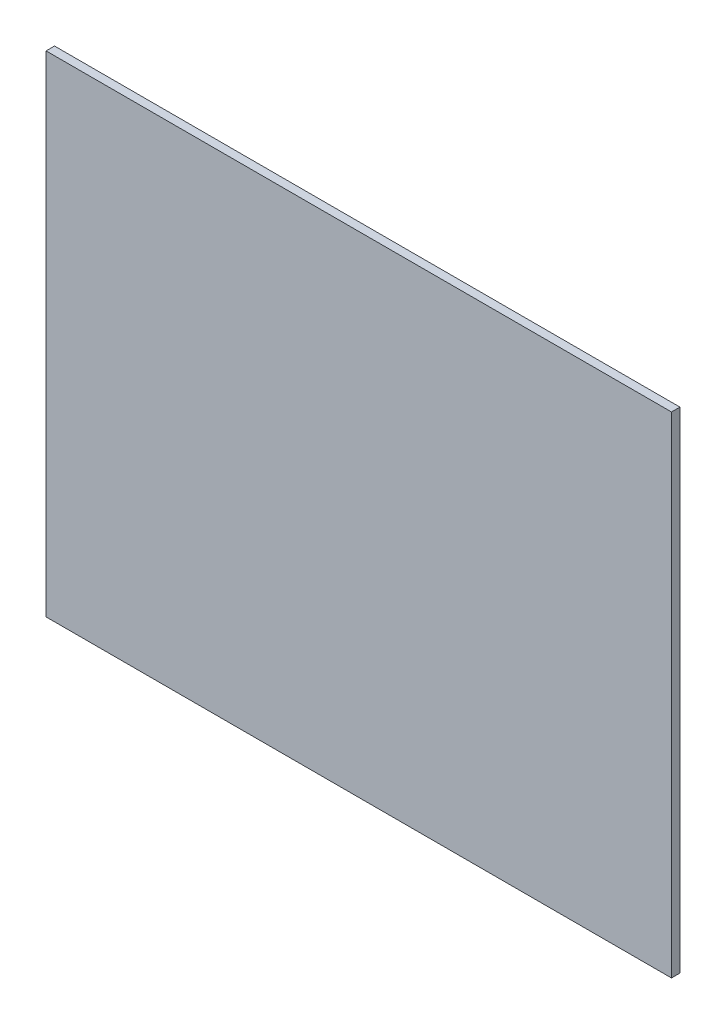
ISO-10303-21;
HEADER;
FILE_DESCRIPTION(('STEP AP214'),'2;1');
FILE_NAME('part.step','',(''),(''),'','','');
FILE_SCHEMA(('AUTOMOTIVE_DESIGN { 1 0 10303 214 1 1 1 1 }'));
ENDSEC;
DATA;
#1=APPLICATION_CONTEXT('core data for automotive mechanical design processes');
#2=APPLICATION_PROTOCOL_DEFINITION('international standard','automotive_design',2000,#1);
#3=PRODUCT_CONTEXT('',#1,'mechanical');
#4=PRODUCT('Part','Part','',(#3));
#5=PRODUCT_RELATED_PRODUCT_CATEGORY('part','',(#4));
#6=PRODUCT_DEFINITION_FORMATION('','',#4);
#7=PRODUCT_DEFINITION_CONTEXT('part definition',#1,'design');
#8=PRODUCT_DEFINITION('design','',#6,#7);
#9=PRODUCT_DEFINITION_SHAPE('','',#8);
#10=(LENGTH_UNIT() NAMED_UNIT(*) SI_UNIT(.MILLI.,.METRE.));
#11=(NAMED_UNIT(*) PLANE_ANGLE_UNIT() SI_UNIT($,.RADIAN.));
#12=(NAMED_UNIT(*) SI_UNIT($,.STERADIAN.) SOLID_ANGLE_UNIT());
#13=UNCERTAINTY_MEASURE_WITH_UNIT(LENGTH_MEASURE(1.E-05),#10,'distance_accuracy_value','');
#14=(GEOMETRIC_REPRESENTATION_CONTEXT(3) GLOBAL_UNCERTAINTY_ASSIGNED_CONTEXT((#13)) GLOBAL_UNIT_ASSIGNED_CONTEXT((#10,
#11,#12)) REPRESENTATION_CONTEXT('',''));
#15=CARTESIAN_POINT('',(0.,0.,0.));
#16=DIRECTION('',(0.,0.,1.));
#17=DIRECTION('',(1.,0.,0.));
#18=AXIS2_PLACEMENT_3D('',#15,#16,#17);
#19=CARTESIAN_POINT('',(0.5,0.87,-2.85063822565036));
#20=DIRECTION('',(0.,1.,0.));
#21=DIRECTION('',(0.,0.,1.));
#22=AXIS2_PLACEMENT_3D('',#19,#20,#21);
#23=PLANE('',#22);
#24=DIRECTION('',(1.,0.,0.));
#25=VECTOR('',#24,1.);
#26=CARTESIAN_POINT('',(0.5,0.87,-0.0300000000000001));
#27=LINE('',#26,#25);
#28=CARTESIAN_POINT('',(-1.72,0.87,-0.0300000000000001));
#29=VERTEX_POINT('',#28);
#30=CARTESIAN_POINT('',(0.5,0.87,-0.0300000000000001));
#31=VERTEX_POINT('',#30);
#32=EDGE_CURVE('E41',#29,#31,#27,.T.);
#33=ORIENTED_EDGE('',*,*,#32,.F.);
#34=DIRECTION('',(0.,0.,1.));
#35=VECTOR('',#34,1.);
#36=CARTESIAN_POINT('',(-1.72,0.87,-2.85063822565036));
#37=LINE('',#36,#35);
#38=CARTESIAN_POINT('',(-1.72,0.87,0.));
#39=VERTEX_POINT('',#38);
#40=EDGE_CURVE('E69',#29,#39,#37,.T.);
#41=ORIENTED_EDGE('',*,*,#40,.T.);
#42=DIRECTION('',(-1.,0.,0.));
#43=VECTOR('',#42,1.);
#44=CARTESIAN_POINT('',(0.5,0.87,0.));
#45=LINE('',#44,#43);
#46=CARTESIAN_POINT('',(0.5,0.87,0.));
#47=VERTEX_POINT('',#46);
#48=EDGE_CURVE('E73',#47,#39,#45,.T.);
#49=ORIENTED_EDGE('',*,*,#48,.F.);
#50=DIRECTION('',(0.,0.,1.));
#51=VECTOR('',#50,1.);
#52=CARTESIAN_POINT('',(0.5,0.87,-2.85063822565036));
#53=LINE('',#52,#51);
#54=EDGE_CURVE('E96',#31,#47,#53,.T.);
#55=ORIENTED_EDGE('',*,*,#54,.F.);
#56=EDGE_LOOP('',(#33,#41,#49,#55));
#57=FACE_BOUND('',#56,.T.);
#58=ADVANCED_FACE('F33',(#57),#23,.T.);
#59=CARTESIAN_POINT('',(0.5,-0.87,-2.85063822565036));
#60=DIRECTION('',(1.,0.,0.));
#61=DIRECTION('',(0.,0.,-1.));
#62=AXIS2_PLACEMENT_3D('',#59,#60,#61);
#63=PLANE('',#62);
#64=DIRECTION('',(0.,-1.,0.));
#65=VECTOR('',#64,1.);
#66=CARTESIAN_POINT('',(0.5,-0.87,-0.0300000000000001));
#67=LINE('',#66,#65);
#68=CARTESIAN_POINT('',(0.5,-0.87,-0.0300000000000001));
#69=VERTEX_POINT('',#68);
#70=EDGE_CURVE('E47',#31,#69,#67,.T.);
#71=ORIENTED_EDGE('',*,*,#70,.F.);
#72=ORIENTED_EDGE('',*,*,#54,.T.);
#73=DIRECTION('',(0.,1.,0.));
#74=VECTOR('',#73,1.);
#75=CARTESIAN_POINT('',(0.5,-0.87,0.));
#76=LINE('',#75,#74);
#77=CARTESIAN_POINT('',(0.5,-0.87,0.));
#78=VERTEX_POINT('',#77);
#79=EDGE_CURVE('E78',#78,#47,#76,.T.);
#80=ORIENTED_EDGE('',*,*,#79,.F.);
#81=DIRECTION('',(0.,0.,1.));
#82=VECTOR('',#81,1.);
#83=CARTESIAN_POINT('',(0.5,-0.87,-2.85063822565036));
#84=LINE('',#83,#82);
#85=EDGE_CURVE('E99',#69,#78,#84,.T.);
#86=ORIENTED_EDGE('',*,*,#85,.F.);
#87=EDGE_LOOP('',(#71,#72,#80,#86));
#88=FACE_BOUND('',#87,.T.);
#89=ADVANCED_FACE('F105',(#88),#63,.T.);
#90=CARTESIAN_POINT('',(-1.72,-0.87,-2.85063822565036));
#91=DIRECTION('',(0.,-1.,0.));
#92=DIRECTION('',(0.,0.,-1.));
#93=AXIS2_PLACEMENT_3D('',#90,#91,#92);
#94=PLANE('',#93);
#95=DIRECTION('',(-1.,0.,0.));
#96=VECTOR('',#95,1.);
#97=CARTESIAN_POINT('',(-1.72,-0.87,-0.0300000000000001));
#98=LINE('',#97,#96);
#99=CARTESIAN_POINT('',(-1.72,-0.87,-0.0300000000000001));
#100=VERTEX_POINT('',#99);
#101=EDGE_CURVE('E98',#69,#100,#98,.T.);
#102=ORIENTED_EDGE('',*,*,#101,.F.);
#103=ORIENTED_EDGE('',*,*,#85,.T.);
#104=DIRECTION('',(1.,0.,0.));
#105=VECTOR('',#104,1.);
#106=CARTESIAN_POINT('',(-1.72,-0.87,0.));
#107=LINE('',#106,#105);
#108=CARTESIAN_POINT('',(-1.72,-0.87,0.));
#109=VERTEX_POINT('',#108);
#110=EDGE_CURVE('E86',#109,#78,#107,.T.);
#111=ORIENTED_EDGE('',*,*,#110,.F.);
#112=DIRECTION('',(0.,0.,1.));
#113=VECTOR('',#112,1.);
#114=CARTESIAN_POINT('',(-1.72,-0.87,-2.85063822565036));
#115=LINE('',#114,#113);
#116=EDGE_CURVE('E77',#100,#109,#115,.T.);
#117=ORIENTED_EDGE('',*,*,#116,.F.);
#118=EDGE_LOOP('',(#102,#103,#111,#117));
#119=FACE_BOUND('',#118,.T.);
#120=ADVANCED_FACE('F103',(#119),#94,.T.);
#121=CARTESIAN_POINT('',(-1.72,0.87,-2.85063822565036));
#122=DIRECTION('',(-1.,0.,0.));
#123=DIRECTION('',(0.,0.,1.));
#124=AXIS2_PLACEMENT_3D('',#121,#122,#123);
#125=PLANE('',#124);
#126=DIRECTION('',(0.,1.,0.));
#127=VECTOR('',#126,1.);
#128=CARTESIAN_POINT('',(-1.72,0.87,-0.0300000000000001));
#129=LINE('',#128,#127);
#130=EDGE_CURVE('E11',#100,#29,#129,.T.);
#131=ORIENTED_EDGE('',*,*,#130,.F.);
#132=ORIENTED_EDGE('',*,*,#116,.T.);
#133=DIRECTION('',(0.,-1.,0.));
#134=VECTOR('',#133,1.);
#135=CARTESIAN_POINT('',(-1.72,0.87,0.));
#136=LINE('',#135,#134);
#137=EDGE_CURVE('E80',#39,#109,#136,.T.);
#138=ORIENTED_EDGE('',*,*,#137,.F.);
#139=ORIENTED_EDGE('',*,*,#40,.F.);
#140=EDGE_LOOP('',(#131,#132,#138,#139));
#141=FACE_BOUND('',#140,.T.);
#142=ADVANCED_FACE('F81',(#141),#125,.T.);
#143=CARTESIAN_POINT('',(0.,0.,0.));
#144=DIRECTION('',(0.,0.,1.));
#145=DIRECTION('',(1.,0.,0.));
#146=AXIS2_PLACEMENT_3D('',#143,#144,#145);
#147=PLANE('',#146);
#148=ORIENTED_EDGE('',*,*,#48,.T.);
#149=ORIENTED_EDGE('',*,*,#137,.T.);
#150=ORIENTED_EDGE('',*,*,#110,.T.);
#151=ORIENTED_EDGE('',*,*,#79,.T.);
#152=EDGE_LOOP('',(#148,#149,#150,#151));
#153=FACE_BOUND('',#152,.T.);
#154=ADVANCED_FACE('F88',(#153),#147,.T.);
#155=CARTESIAN_POINT('',(0.,0.,-0.03));
#156=DIRECTION('',(0.,0.,1.));
#157=DIRECTION('',(0.,1.,0.));
#158=AXIS2_PLACEMENT_3D('',#155,#156,#157);
#159=PLANE('',#158);
#160=ORIENTED_EDGE('',*,*,#32,.T.);
#161=ORIENTED_EDGE('',*,*,#70,.T.);
#162=ORIENTED_EDGE('',*,*,#101,.T.);
#163=ORIENTED_EDGE('',*,*,#130,.T.);
#164=EDGE_LOOP('',(#160,#161,#162,#163));
#165=FACE_BOUND('',#164,.T.);
#166=ADVANCED_FACE('F107',(#165),#159,.F.);
#167=CLOSED_SHELL('',(#58,#89,#120,#142,#154,#166));
#168=MANIFOLD_SOLID_BREP('B2',#167);
#169=ADVANCED_BREP_SHAPE_REPRESENTATION('',(#18,#168),#14);
#170=SHAPE_DEFINITION_REPRESENTATION(#9,#169);
ENDSEC;
END-ISO-10303-21;
